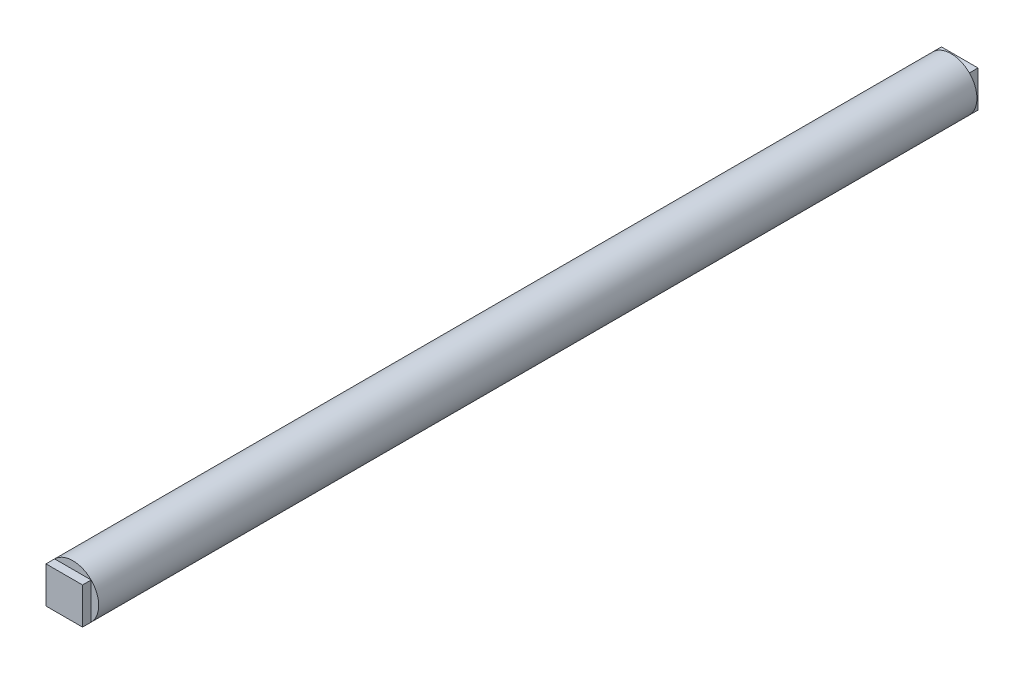
ISO-10303-21;
HEADER;
FILE_DESCRIPTION(('STEP AP214'),'2;1');
FILE_NAME('part.step','',(''),(''),'','','');
FILE_SCHEMA(('AUTOMOTIVE_DESIGN { 1 0 10303 214 1 1 1 1 }'));
ENDSEC;
DATA;
#1=APPLICATION_CONTEXT('core data for automotive mechanical design processes');
#2=APPLICATION_PROTOCOL_DEFINITION('international standard','automotive_design',2000,#1);
#3=PRODUCT_CONTEXT('',#1,'mechanical');
#4=PRODUCT('Part','Part','',(#3));
#5=PRODUCT_RELATED_PRODUCT_CATEGORY('part','',(#4));
#6=PRODUCT_DEFINITION_FORMATION('','',#4);
#7=PRODUCT_DEFINITION_CONTEXT('part definition',#1,'design');
#8=PRODUCT_DEFINITION('design','',#6,#7);
#9=PRODUCT_DEFINITION_SHAPE('','',#8);
#10=(LENGTH_UNIT() NAMED_UNIT(*) SI_UNIT(.MILLI.,.METRE.));
#11=(NAMED_UNIT(*) PLANE_ANGLE_UNIT() SI_UNIT($,.RADIAN.));
#12=(NAMED_UNIT(*) SI_UNIT($,.STERADIAN.) SOLID_ANGLE_UNIT());
#13=UNCERTAINTY_MEASURE_WITH_UNIT(LENGTH_MEASURE(1.E-05),#10,'distance_accuracy_value','');
#14=(GEOMETRIC_REPRESENTATION_CONTEXT(3) GLOBAL_UNCERTAINTY_ASSIGNED_CONTEXT((#13)) GLOBAL_UNIT_ASSIGNED_CONTEXT((#10,
#11,#12)) REPRESENTATION_CONTEXT('',''));
#15=CARTESIAN_POINT('',(0.,0.,0.));
#16=DIRECTION('',(0.,0.,1.));
#17=DIRECTION('',(1.,0.,0.));
#18=AXIS2_PLACEMENT_3D('',#15,#16,#17);
#19=CARTESIAN_POINT('',(0.,0.,102.));
#20=DIRECTION('',(0.,0.,1.));
#21=DIRECTION('',(1.,0.,0.));
#22=AXIS2_PLACEMENT_3D('',#19,#20,#21);
#23=PLANE('',#22);
#24=DIRECTION('',(0.,1.,0.));
#25=VECTOR('',#24,1.);
#26=CARTESIAN_POINT('',(2.12,2.12263986582746,102.));
#27=LINE('',#26,#25);
#28=CARTESIAN_POINT('',(2.12,-2.12263986582746,102.));
#29=VERTEX_POINT('',#28);
#30=CARTESIAN_POINT('',(2.12,2.12263986582746,102.));
#31=VERTEX_POINT('',#30);
#32=EDGE_CURVE('E49',#29,#31,#27,.T.);
#33=ORIENTED_EDGE('',*,*,#32,.F.);
#34=CARTESIAN_POINT('',(0.,0.,102.));
#35=DIRECTION('',(0.,0.,1.));
#36=DIRECTION('',(1.,0.,0.));
#37=AXIS2_PLACEMENT_3D('',#34,#35,#36);
#38=CIRCLE('',#37,3.);
#39=EDGE_CURVE('E43',#29,#31,#38,.T.);
#40=ORIENTED_EDGE('',*,*,#39,.T.);
#41=EDGE_LOOP('',(#33,#40));
#42=FACE_BOUND('',#41,.T.);
#43=ADVANCED_FACE('F33',(#42),#23,.T.);
#44=DIRECTION('',(1.,0.,0.));
#45=VECTOR('',#44,1.);
#46=CARTESIAN_POINT('',(-2.12,-2.12263986582746,102.));
#47=LINE('',#46,#45);
#48=CARTESIAN_POINT('',(-2.12,-2.12263986582746,102.));
#49=VERTEX_POINT('',#48);
#50=EDGE_CURVE('E56',#49,#29,#47,.T.);
#51=ORIENTED_EDGE('',*,*,#50,.F.);
#52=EDGE_CURVE('E172',#49,#29,#38,.T.);
#53=ORIENTED_EDGE('',*,*,#52,.T.);
#54=EDGE_LOOP('',(#51,#53));
#55=FACE_BOUND('',#54,.T.);
#56=ADVANCED_FACE('F207',(#55),#23,.T.);
#57=DIRECTION('',(0.,-1.,0.));
#58=VECTOR('',#57,1.);
#59=CARTESIAN_POINT('',(-2.12,2.12263986582746,102.));
#60=LINE('',#59,#58);
#61=CARTESIAN_POINT('',(-2.12,2.12263986582746,102.));
#62=VERTEX_POINT('',#61);
#63=EDGE_CURVE('E230',#62,#49,#60,.T.);
#64=ORIENTED_EDGE('',*,*,#63,.F.);
#65=EDGE_CURVE('E42',#62,#49,#38,.T.);
#66=ORIENTED_EDGE('',*,*,#65,.T.);
#67=EDGE_LOOP('',(#64,#66));
#68=FACE_BOUND('',#67,.T.);
#69=ADVANCED_FACE('F213',(#68),#23,.T.);
#70=CARTESIAN_POINT('',(0.,0.,0.));
#71=DIRECTION('',(0.,0.,1.));
#72=DIRECTION('',(1.,0.,0.));
#73=AXIS2_PLACEMENT_3D('',#70,#71,#72);
#74=PLANE('',#73);
#75=DIRECTION('',(-1.,0.,0.));
#76=VECTOR('',#75,1.);
#77=CARTESIAN_POINT('',(2.12132034355964,-2.12132034355964,0.));
#78=LINE('',#77,#76);
#79=CARTESIAN_POINT('',(2.12132034355964,-2.12132034355964,0.));
#80=VERTEX_POINT('',#79);
#81=CARTESIAN_POINT('',(-2.12132034355964,-2.12132034355964,0.));
#82=VERTEX_POINT('',#81);
#83=EDGE_CURVE('E123',#80,#82,#78,.T.);
#84=ORIENTED_EDGE('',*,*,#83,.F.);
#85=CARTESIAN_POINT('',(0.,0.,0.));
#86=DIRECTION('',(0.,0.,1.));
#87=DIRECTION('',(1.,0.,0.));
#88=AXIS2_PLACEMENT_3D('',#85,#86,#87);
#89=CIRCLE('',#88,3.);
#90=EDGE_CURVE('E164',#82,#80,#89,.T.);
#91=ORIENTED_EDGE('',*,*,#90,.F.);
#92=EDGE_LOOP('',(#84,#91));
#93=FACE_BOUND('',#92,.T.);
#94=ADVANCED_FACE('F193',(#93),#74,.F.);
#95=DIRECTION('',(0.,-1.,0.));
#96=VECTOR('',#95,1.);
#97=CARTESIAN_POINT('',(2.12132034355964,2.12132034355964,0.));
#98=LINE('',#97,#96);
#99=CARTESIAN_POINT('',(2.12132034355964,2.12132034355964,0.));
#100=VERTEX_POINT('',#99);
#101=EDGE_CURVE('E136',#100,#80,#98,.T.);
#102=ORIENTED_EDGE('',*,*,#101,.F.);
#103=EDGE_CURVE('E160',#80,#100,#89,.T.);
#104=ORIENTED_EDGE('',*,*,#103,.F.);
#105=EDGE_LOOP('',(#102,#104));
#106=FACE_BOUND('',#105,.T.);
#107=ADVANCED_FACE('F195',(#106),#74,.F.);
#108=DIRECTION('',(1.,0.,0.));
#109=VECTOR('',#108,1.);
#110=CARTESIAN_POINT('',(-2.12132034355964,2.12132034355964,0.));
#111=LINE('',#110,#109);
#112=CARTESIAN_POINT('',(-2.12132034355964,2.12132034355964,0.));
#113=VERTEX_POINT('',#112);
#114=EDGE_CURVE('E145',#113,#100,#111,.T.);
#115=ORIENTED_EDGE('',*,*,#114,.F.);
#116=EDGE_CURVE('E37',#100,#113,#89,.T.);
#117=ORIENTED_EDGE('',*,*,#116,.F.);
#118=EDGE_LOOP('',(#115,#117));
#119=FACE_BOUND('',#118,.T.);
#120=ADVANCED_FACE('F178',(#119),#74,.F.);
#121=DIRECTION('',(0.,1.,0.));
#122=VECTOR('',#121,1.);
#123=CARTESIAN_POINT('',(-2.12132034355964,-2.12132034355964,0.));
#124=LINE('',#123,#122);
#125=EDGE_CURVE('E126',#82,#113,#124,.T.);
#126=ORIENTED_EDGE('',*,*,#125,.F.);
#127=EDGE_CURVE('E169',#113,#82,#89,.T.);
#128=ORIENTED_EDGE('',*,*,#127,.F.);
#129=EDGE_LOOP('',(#126,#128));
#130=FACE_BOUND('',#129,.T.);
#131=ADVANCED_FACE('F176',(#130),#74,.F.);
#132=CARTESIAN_POINT('',(0.,0.,102.));
#133=DIRECTION('',(0.,0.,-1.));
#134=DIRECTION('',(-1.,0.,0.));
#135=AXIS2_PLACEMENT_3D('',#132,#133,#134);
#136=CYLINDRICAL_SURFACE('',#135,3.);
#137=EDGE_CURVE('E11',#31,#62,#38,.T.);
#138=ORIENTED_EDGE('',*,*,#137,.F.);
#139=ORIENTED_EDGE('',*,*,#39,.F.);
#140=ORIENTED_EDGE('',*,*,#52,.F.);
#141=ORIENTED_EDGE('',*,*,#65,.F.);
#142=EDGE_LOOP('',(#138,#139,#140,#141));
#143=FACE_BOUND('',#142,.T.);
#144=ORIENTED_EDGE('',*,*,#116,.T.);
#145=ORIENTED_EDGE('',*,*,#127,.T.);
#146=ORIENTED_EDGE('',*,*,#90,.T.);
#147=ORIENTED_EDGE('',*,*,#103,.T.);
#148=EDGE_LOOP('',(#144,#145,#146,#147));
#149=FACE_BOUND('',#148,.T.);
#150=ADVANCED_FACE('F35',(#143,#149),#136,.T.);
#151=DIRECTION('',(-1.,0.,0.));
#152=VECTOR('',#151,1.);
#153=CARTESIAN_POINT('',(-2.12,2.12263986582746,102.));
#154=LINE('',#153,#152);
#155=EDGE_CURVE('E235',#31,#62,#154,.T.);
#156=ORIENTED_EDGE('',*,*,#155,.F.);
#157=ORIENTED_EDGE('',*,*,#137,.T.);
#158=EDGE_LOOP('',(#156,#157));
#159=FACE_BOUND('',#158,.T.);
#160=ADVANCED_FACE('F209',(#159),#23,.T.);
#161=CARTESIAN_POINT('',(2.12132034355964,-2.12132034355964,-1.));
#162=DIRECTION('',(0.,1.,0.));
#163=DIRECTION('',(0.,0.,1.));
#164=AXIS2_PLACEMENT_3D('',#161,#162,#163);
#165=PLANE('',#164);
#166=ORIENTED_EDGE('',*,*,#83,.T.);
#167=DIRECTION('',(0.,0.,1.));
#168=VECTOR('',#167,1.);
#169=CARTESIAN_POINT('',(-2.12132034355964,-2.12132034355964,-1.));
#170=LINE('',#169,#168);
#171=CARTESIAN_POINT('',(-2.12132034355964,-2.12132034355964,-1.));
#172=VERTEX_POINT('',#171);
#173=EDGE_CURVE('E158',#172,#82,#170,.T.);
#174=ORIENTED_EDGE('',*,*,#173,.F.);
#175=DIRECTION('',(-1.,0.,0.));
#176=VECTOR('',#175,1.);
#177=CARTESIAN_POINT('',(2.12132034355964,-2.12132034355964,-1.));
#178=LINE('',#177,#176);
#179=CARTESIAN_POINT('',(2.12132034355964,-2.12132034355964,-1.));
#180=VERTEX_POINT('',#179);
#181=EDGE_CURVE('E132',#180,#172,#178,.T.);
#182=ORIENTED_EDGE('',*,*,#181,.F.);
#183=DIRECTION('',(0.,0.,1.));
#184=VECTOR('',#183,1.);
#185=CARTESIAN_POINT('',(2.12132034355964,-2.12132034355964,-1.));
#186=LINE('',#185,#184);
#187=EDGE_CURVE('E141',#180,#80,#186,.T.);
#188=ORIENTED_EDGE('',*,*,#187,.T.);
#189=EDGE_LOOP('',(#166,#174,#182,#188));
#190=FACE_BOUND('',#189,.T.);
#191=ADVANCED_FACE('F191',(#190),#165,.F.);
#192=CARTESIAN_POINT('',(-2.12132034355964,-2.12132034355964,-1.));
#193=DIRECTION('',(1.,0.,0.));
#194=DIRECTION('',(0.,0.,-1.));
#195=AXIS2_PLACEMENT_3D('',#192,#193,#194);
#196=PLANE('',#195);
#197=ORIENTED_EDGE('',*,*,#125,.T.);
#198=DIRECTION('',(0.,0.,1.));
#199=VECTOR('',#198,1.);
#200=CARTESIAN_POINT('',(-2.12132034355964,2.12132034355964,-1.));
#201=LINE('',#200,#199);
#202=CARTESIAN_POINT('',(-2.12132034355964,2.12132034355964,-1.));
#203=VERTEX_POINT('',#202);
#204=EDGE_CURVE('E155',#203,#113,#201,.T.);
#205=ORIENTED_EDGE('',*,*,#204,.F.);
#206=DIRECTION('',(0.,1.,0.));
#207=VECTOR('',#206,1.);
#208=CARTESIAN_POINT('',(-2.12132034355964,-2.12132034355964,-1.));
#209=LINE('',#208,#207);
#210=EDGE_CURVE('E135',#172,#203,#209,.T.);
#211=ORIENTED_EDGE('',*,*,#210,.F.);
#212=ORIENTED_EDGE('',*,*,#173,.T.);
#213=EDGE_LOOP('',(#197,#205,#211,#212));
#214=FACE_BOUND('',#213,.T.);
#215=ADVANCED_FACE('F182',(#214),#196,.F.);
#216=CARTESIAN_POINT('',(-2.12132034355964,2.12132034355964,-1.));
#217=DIRECTION('',(0.,-1.,0.));
#218=DIRECTION('',(0.,0.,-1.));
#219=AXIS2_PLACEMENT_3D('',#216,#217,#218);
#220=PLANE('',#219);
#221=ORIENTED_EDGE('',*,*,#114,.T.);
#222=DIRECTION('',(0.,0.,1.));
#223=VECTOR('',#222,1.);
#224=CARTESIAN_POINT('',(2.12132034355964,2.12132034355964,-1.));
#225=LINE('',#224,#223);
#226=CARTESIAN_POINT('',(2.12132034355964,2.12132034355964,-1.));
#227=VERTEX_POINT('',#226);
#228=EDGE_CURVE('E152',#227,#100,#225,.T.);
#229=ORIENTED_EDGE('',*,*,#228,.F.);
#230=DIRECTION('',(1.,0.,0.));
#231=VECTOR('',#230,1.);
#232=CARTESIAN_POINT('',(-2.12132034355964,2.12132034355964,-1.));
#233=LINE('',#232,#231);
#234=EDGE_CURVE('E138',#203,#227,#233,.T.);
#235=ORIENTED_EDGE('',*,*,#234,.F.);
#236=ORIENTED_EDGE('',*,*,#204,.T.);
#237=EDGE_LOOP('',(#221,#229,#235,#236));
#238=FACE_BOUND('',#237,.T.);
#239=ADVANCED_FACE('F184',(#238),#220,.F.);
#240=CARTESIAN_POINT('',(2.12132034355964,2.12132034355964,-1.));
#241=DIRECTION('',(-1.,0.,0.));
#242=DIRECTION('',(0.,0.,1.));
#243=AXIS2_PLACEMENT_3D('',#240,#241,#242);
#244=PLANE('',#243);
#245=ORIENTED_EDGE('',*,*,#101,.T.);
#246=ORIENTED_EDGE('',*,*,#187,.F.);
#247=DIRECTION('',(0.,-1.,0.));
#248=VECTOR('',#247,1.);
#249=CARTESIAN_POINT('',(2.12132034355964,2.12132034355964,-1.));
#250=LINE('',#249,#248);
#251=EDGE_CURVE('E140',#227,#180,#250,.T.);
#252=ORIENTED_EDGE('',*,*,#251,.F.);
#253=ORIENTED_EDGE('',*,*,#228,.T.);
#254=EDGE_LOOP('',(#245,#246,#252,#253));
#255=FACE_BOUND('',#254,.T.);
#256=ADVANCED_FACE('F197',(#255),#244,.F.);
#257=CARTESIAN_POINT('',(0.,0.,-1.));
#258=DIRECTION('',(0.,0.,-1.));
#259=DIRECTION('',(-1.,0.,0.));
#260=AXIS2_PLACEMENT_3D('',#257,#258,#259);
#261=PLANE('',#260);
#262=ORIENTED_EDGE('',*,*,#181,.T.);
#263=ORIENTED_EDGE('',*,*,#210,.T.);
#264=ORIENTED_EDGE('',*,*,#234,.T.);
#265=ORIENTED_EDGE('',*,*,#251,.T.);
#266=EDGE_LOOP('',(#262,#263,#264,#265));
#267=FACE_BOUND('',#266,.T.);
#268=ADVANCED_FACE('F187',(#267),#261,.T.);
#269=CARTESIAN_POINT('',(2.12,2.12263986582746,103.));
#270=DIRECTION('',(-1.,0.,0.));
#271=DIRECTION('',(0.,0.,1.));
#272=AXIS2_PLACEMENT_3D('',#269,#270,#271);
#273=PLANE('',#272);
#274=ORIENTED_EDGE('',*,*,#32,.T.);
#275=DIRECTION('',(0.,0.,-1.));
#276=VECTOR('',#275,1.);
#277=CARTESIAN_POINT('',(2.12,2.12263986582746,103.));
#278=LINE('',#277,#276);
#279=CARTESIAN_POINT('',(2.12,2.12263986582746,103.));
#280=VERTEX_POINT('',#279);
#281=EDGE_CURVE('E106',#280,#31,#278,.T.);
#282=ORIENTED_EDGE('',*,*,#281,.F.);
#283=DIRECTION('',(0.,1.,0.));
#284=VECTOR('',#283,1.);
#285=CARTESIAN_POINT('',(2.12,2.12263986582746,103.));
#286=LINE('',#285,#284);
#287=CARTESIAN_POINT('',(2.12,-2.12263986582746,103.));
#288=VERTEX_POINT('',#287);
#289=EDGE_CURVE('E112',#288,#280,#286,.T.);
#290=ORIENTED_EDGE('',*,*,#289,.F.);
#291=DIRECTION('',(0.,0.,-1.));
#292=VECTOR('',#291,1.);
#293=CARTESIAN_POINT('',(2.12,-2.12263986582746,103.));
#294=LINE('',#293,#292);
#295=EDGE_CURVE('E240',#288,#29,#294,.T.);
#296=ORIENTED_EDGE('',*,*,#295,.T.);
#297=EDGE_LOOP('',(#274,#282,#290,#296));
#298=FACE_BOUND('',#297,.T.);
#299=ADVANCED_FACE('F122',(#298),#273,.F.);
#300=CARTESIAN_POINT('',(-2.12,2.12263986582746,103.));
#301=DIRECTION('',(0.,-1.,0.));
#302=DIRECTION('',(0.,0.,-1.));
#303=AXIS2_PLACEMENT_3D('',#300,#301,#302);
#304=PLANE('',#303);
#305=ORIENTED_EDGE('',*,*,#155,.T.);
#306=DIRECTION('',(0.,0.,-1.));
#307=VECTOR('',#306,1.);
#308=CARTESIAN_POINT('',(-2.12,2.12263986582746,103.));
#309=LINE('',#308,#307);
#310=CARTESIAN_POINT('',(-2.12,2.12263986582746,103.));
#311=VERTEX_POINT('',#310);
#312=EDGE_CURVE('E108',#311,#62,#309,.T.);
#313=ORIENTED_EDGE('',*,*,#312,.F.);
#314=DIRECTION('',(-1.,0.,0.));
#315=VECTOR('',#314,1.);
#316=CARTESIAN_POINT('',(-2.12,2.12263986582746,103.));
#317=LINE('',#316,#315);
#318=EDGE_CURVE('E101',#280,#311,#317,.T.);
#319=ORIENTED_EDGE('',*,*,#318,.F.);
#320=ORIENTED_EDGE('',*,*,#281,.T.);
#321=EDGE_LOOP('',(#305,#313,#319,#320));
#322=FACE_BOUND('',#321,.T.);
#323=ADVANCED_FACE('F104',(#322),#304,.F.);
#324=CARTESIAN_POINT('',(-2.12,2.12263986582746,103.));
#325=DIRECTION('',(1.,0.,0.));
#326=DIRECTION('',(0.,0.,-1.));
#327=AXIS2_PLACEMENT_3D('',#324,#325,#326);
#328=PLANE('',#327);
#329=ORIENTED_EDGE('',*,*,#63,.T.);
#330=DIRECTION('',(0.,0.,-1.));
#331=VECTOR('',#330,1.);
#332=CARTESIAN_POINT('',(-2.12,-2.12263986582746,103.));
#333=LINE('',#332,#331);
#334=CARTESIAN_POINT('',(-2.12,-2.12263986582746,103.));
#335=VERTEX_POINT('',#334);
#336=EDGE_CURVE('E128',#335,#49,#333,.T.);
#337=ORIENTED_EDGE('',*,*,#336,.F.);
#338=DIRECTION('',(0.,-1.,0.));
#339=VECTOR('',#338,1.);
#340=CARTESIAN_POINT('',(-2.12,2.12263986582746,103.));
#341=LINE('',#340,#339);
#342=EDGE_CURVE('E111',#311,#335,#341,.T.);
#343=ORIENTED_EDGE('',*,*,#342,.F.);
#344=ORIENTED_EDGE('',*,*,#312,.T.);
#345=EDGE_LOOP('',(#329,#337,#343,#344));
#346=FACE_BOUND('',#345,.T.);
#347=ADVANCED_FACE('F238',(#346),#328,.F.);
#348=CARTESIAN_POINT('',(-2.12,-2.12263986582746,103.));
#349=DIRECTION('',(0.,1.,0.));
#350=DIRECTION('',(0.,0.,1.));
#351=AXIS2_PLACEMENT_3D('',#348,#349,#350);
#352=PLANE('',#351);
#353=ORIENTED_EDGE('',*,*,#50,.T.);
#354=ORIENTED_EDGE('',*,*,#295,.F.);
#355=DIRECTION('',(1.,0.,0.));
#356=VECTOR('',#355,1.);
#357=CARTESIAN_POINT('',(-2.12,-2.12263986582746,103.));
#358=LINE('',#357,#356);
#359=EDGE_CURVE('E117',#335,#288,#358,.T.);
#360=ORIENTED_EDGE('',*,*,#359,.F.);
#361=ORIENTED_EDGE('',*,*,#336,.T.);
#362=EDGE_LOOP('',(#353,#354,#360,#361));
#363=FACE_BOUND('',#362,.T.);
#364=ADVANCED_FACE('F246',(#363),#352,.F.);
#365=CARTESIAN_POINT('',(0.,0.,103.));
#366=DIRECTION('',(0.,0.,1.));
#367=DIRECTION('',(1.,0.,0.));
#368=AXIS2_PLACEMENT_3D('',#365,#366,#367);
#369=PLANE('',#368);
#370=ORIENTED_EDGE('',*,*,#289,.T.);
#371=ORIENTED_EDGE('',*,*,#318,.T.);
#372=ORIENTED_EDGE('',*,*,#342,.T.);
#373=ORIENTED_EDGE('',*,*,#359,.T.);
#374=EDGE_LOOP('',(#370,#371,#372,#373));
#375=FACE_BOUND('',#374,.T.);
#376=ADVANCED_FACE('F115',(#375),#369,.T.);
#377=CLOSED_SHELL('',(#43,#56,#69,#94,#107,#120,#131,#150,#160,#191,#215,#239,#256,#268,#299,
#323,#347,#364,#376));
#378=MANIFOLD_SOLID_BREP('B2',#377);
#379=ADVANCED_BREP_SHAPE_REPRESENTATION('',(#18,#378),#14);
#380=SHAPE_DEFINITION_REPRESENTATION(#9,#379);
ENDSEC;
END-ISO-10303-21;
